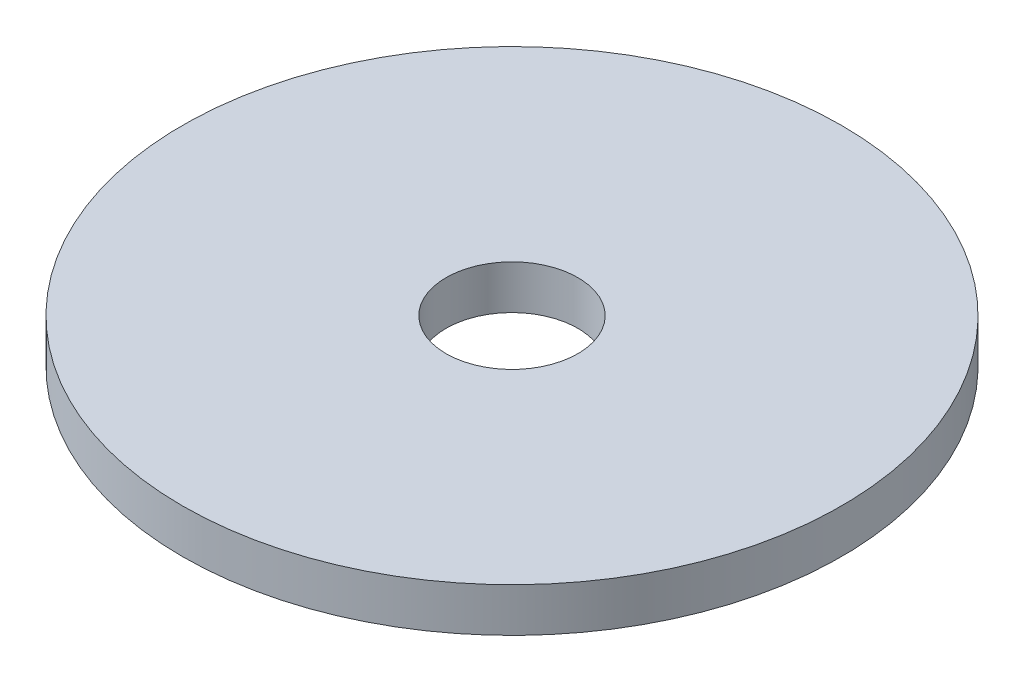
ISO-10303-21;
HEADER;
FILE_DESCRIPTION(('STEP AP214'),'2;1');
FILE_NAME('part.step','',(''),(''),'','','');
FILE_SCHEMA(('AUTOMOTIVE_DESIGN { 1 0 10303 214 1 1 1 1 }'));
ENDSEC;
DATA;
#1=APPLICATION_CONTEXT('core data for automotive mechanical design processes');
#2=APPLICATION_PROTOCOL_DEFINITION('international standard','automotive_design',2000,#1);
#3=PRODUCT_CONTEXT('',#1,'mechanical');
#4=PRODUCT('Part','Part','',(#3));
#5=PRODUCT_RELATED_PRODUCT_CATEGORY('part','',(#4));
#6=PRODUCT_DEFINITION_FORMATION('','',#4);
#7=PRODUCT_DEFINITION_CONTEXT('part definition',#1,'design');
#8=PRODUCT_DEFINITION('design','',#6,#7);
#9=PRODUCT_DEFINITION_SHAPE('','',#8);
#10=(LENGTH_UNIT() NAMED_UNIT(*) SI_UNIT(.MILLI.,.METRE.));
#11=(NAMED_UNIT(*) PLANE_ANGLE_UNIT() SI_UNIT($,.RADIAN.));
#12=(NAMED_UNIT(*) SI_UNIT($,.STERADIAN.) SOLID_ANGLE_UNIT());
#13=UNCERTAINTY_MEASURE_WITH_UNIT(LENGTH_MEASURE(1.E-05),#10,'distance_accuracy_value','');
#14=(GEOMETRIC_REPRESENTATION_CONTEXT(3) GLOBAL_UNCERTAINTY_ASSIGNED_CONTEXT((#13)) GLOBAL_UNIT_ASSIGNED_CONTEXT((#10,
#11,#12)) REPRESENTATION_CONTEXT('',''));
#15=CARTESIAN_POINT('',(0.,0.,0.));
#16=DIRECTION('',(0.,0.,1.));
#17=DIRECTION('',(1.,0.,0.));
#18=AXIS2_PLACEMENT_3D('',#15,#16,#17);
#19=CARTESIAN_POINT('',(0.,2.,0.));
#20=DIRECTION('',(0.,1.,0.));
#21=DIRECTION('',(0.,0.,1.));
#22=AXIS2_PLACEMENT_3D('',#19,#20,#21);
#23=PLANE('',#22);
#24=CARTESIAN_POINT('',(0.,2.,0.));
#25=DIRECTION('',(0.,1.,0.));
#26=DIRECTION('',(0.,0.,1.));
#27=AXIS2_PLACEMENT_3D('',#24,#25,#26);
#28=CIRCLE('',#27,15.);
#29=CARTESIAN_POINT('',(0.,2.,15.));
#30=VERTEX_POINT('',#29);
#31=EDGE_CURVE('E10',#30,#30,#28,.T.);
#32=ORIENTED_EDGE('',*,*,#31,.T.);
#33=EDGE_LOOP('',(#32));
#34=FACE_BOUND('',#33,.T.);
#35=CARTESIAN_POINT('',(0.,2.,0.));
#36=DIRECTION('',(0.,1.,0.));
#37=DIRECTION('',(0.,0.,1.));
#38=AXIS2_PLACEMENT_3D('',#35,#36,#37);
#39=CIRCLE('',#38,3.);
#40=CARTESIAN_POINT('',(0.,2.,3.));
#41=VERTEX_POINT('',#40);
#42=EDGE_CURVE('E44',#41,#41,#39,.T.);
#43=ORIENTED_EDGE('',*,*,#42,.F.);
#44=EDGE_LOOP('',(#43));
#45=FACE_BOUND('',#44,.T.);
#46=ADVANCED_FACE('F33',(#34,#45),#23,.T.);
#47=CARTESIAN_POINT('',(0.,0.,0.));
#48=DIRECTION('',(0.,1.,0.));
#49=DIRECTION('',(0.,0.,1.));
#50=AXIS2_PLACEMENT_3D('',#47,#48,#49);
#51=PLANE('',#50);
#52=CARTESIAN_POINT('',(0.,0.,0.));
#53=DIRECTION('',(0.,1.,0.));
#54=DIRECTION('',(0.,0.,1.));
#55=AXIS2_PLACEMENT_3D('',#52,#53,#54);
#56=CIRCLE('',#55,15.);
#57=CARTESIAN_POINT('',(0.,0.,15.));
#58=VERTEX_POINT('',#57);
#59=EDGE_CURVE('E37',#58,#58,#56,.T.);
#60=ORIENTED_EDGE('',*,*,#59,.F.);
#61=EDGE_LOOP('',(#60));
#62=FACE_BOUND('',#61,.T.);
#63=CARTESIAN_POINT('',(0.,0.,0.));
#64=DIRECTION('',(0.,1.,0.));
#65=DIRECTION('',(0.,0.,1.));
#66=AXIS2_PLACEMENT_3D('',#63,#64,#65);
#67=CIRCLE('',#66,3.);
#68=CARTESIAN_POINT('',(0.,0.,3.));
#69=VERTEX_POINT('',#68);
#70=EDGE_CURVE('E46',#69,#69,#67,.T.);
#71=ORIENTED_EDGE('',*,*,#70,.T.);
#72=EDGE_LOOP('',(#71));
#73=FACE_BOUND('',#72,.T.);
#74=ADVANCED_FACE('F56',(#62,#73),#51,.F.);
#75=CARTESIAN_POINT('',(0.,2.,0.));
#76=DIRECTION('',(0.,-1.,0.));
#77=DIRECTION('',(0.,0.,-1.));
#78=AXIS2_PLACEMENT_3D('',#75,#76,#77);
#79=CYLINDRICAL_SURFACE('',#78,15.);
#80=ORIENTED_EDGE('',*,*,#31,.F.);
#81=EDGE_LOOP('',(#80));
#82=FACE_BOUND('',#81,.T.);
#83=ORIENTED_EDGE('',*,*,#59,.T.);
#84=EDGE_LOOP('',(#83));
#85=FACE_BOUND('',#84,.T.);
#86=ADVANCED_FACE('F35',(#82,#85),#79,.T.);
#87=CARTESIAN_POINT('',(0.,2.,0.));
#88=DIRECTION('',(0.,-1.,0.));
#89=DIRECTION('',(0.,0.,-1.));
#90=AXIS2_PLACEMENT_3D('',#87,#88,#89);
#91=CYLINDRICAL_SURFACE('',#90,3.);
#92=ORIENTED_EDGE('',*,*,#42,.T.);
#93=EDGE_LOOP('',(#92));
#94=FACE_BOUND('',#93,.T.);
#95=ORIENTED_EDGE('',*,*,#70,.F.);
#96=EDGE_LOOP('',(#95));
#97=FACE_BOUND('',#96,.T.);
#98=ADVANCED_FACE('F52',(#94,#97),#91,.F.);
#99=CLOSED_SHELL('',(#46,#74,#86,#98));
#100=MANIFOLD_SOLID_BREP('B2',#99);
#101=ADVANCED_BREP_SHAPE_REPRESENTATION('',(#18,#100),#14);
#102=SHAPE_DEFINITION_REPRESENTATION(#9,#101);
ENDSEC;
END-ISO-10303-21;
